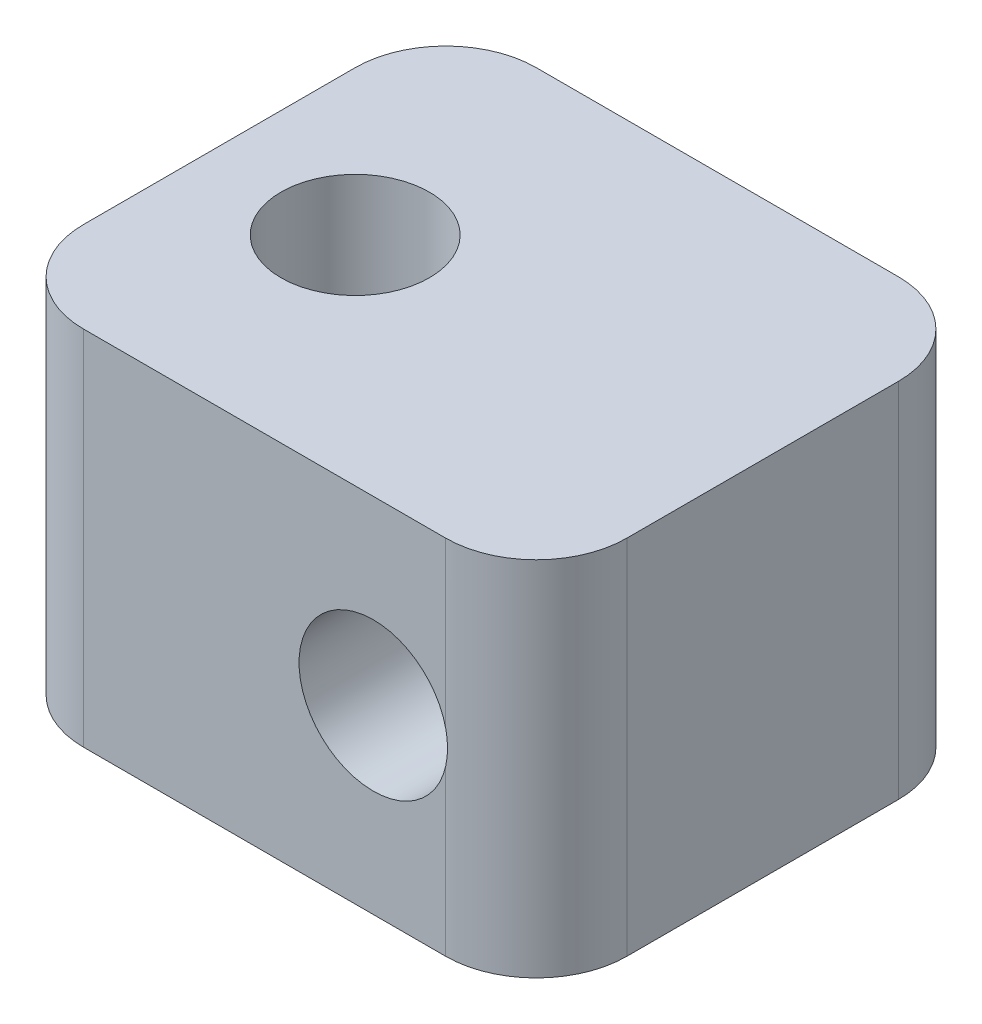
ISO-10303-21;
HEADER;
FILE_DESCRIPTION(('STEP AP214'),'2;1');
FILE_NAME('part.step','',(''),(''),'','','');
FILE_SCHEMA(('AUTOMOTIVE_DESIGN { 1 0 10303 214 1 1 1 1 }'));
ENDSEC;
DATA;
#1=APPLICATION_CONTEXT('core data for automotive mechanical design processes');
#2=APPLICATION_PROTOCOL_DEFINITION('international standard','automotive_design',2000,#1);
#3=PRODUCT_CONTEXT('',#1,'mechanical');
#4=PRODUCT('Part','Part','',(#3));
#5=PRODUCT_RELATED_PRODUCT_CATEGORY('part','',(#4));
#6=PRODUCT_DEFINITION_FORMATION('','',#4);
#7=PRODUCT_DEFINITION_CONTEXT('part definition',#1,'design');
#8=PRODUCT_DEFINITION('design','',#6,#7);
#9=PRODUCT_DEFINITION_SHAPE('','',#8);
#10=(LENGTH_UNIT() NAMED_UNIT(*) SI_UNIT(.MILLI.,.METRE.));
#11=(NAMED_UNIT(*) PLANE_ANGLE_UNIT() SI_UNIT($,.RADIAN.));
#12=(NAMED_UNIT(*) SI_UNIT($,.STERADIAN.) SOLID_ANGLE_UNIT());
#13=UNCERTAINTY_MEASURE_WITH_UNIT(LENGTH_MEASURE(1.E-05),#10,'distance_accuracy_value','');
#14=(GEOMETRIC_REPRESENTATION_CONTEXT(3) GLOBAL_UNCERTAINTY_ASSIGNED_CONTEXT((#13)) GLOBAL_UNIT_ASSIGNED_CONTEXT((#10,
#11,#12)) REPRESENTATION_CONTEXT('',''));
#15=CARTESIAN_POINT('',(0.,0.,0.));
#16=DIRECTION('',(0.,0.,1.));
#17=DIRECTION('',(1.,0.,0.));
#18=AXIS2_PLACEMENT_3D('',#15,#16,#17);
#19=CARTESIAN_POINT('',(15.,10.,25.));
#20=DIRECTION('',(-1.,0.,0.));
#21=DIRECTION('',(0.,-1.,0.));
#22=AXIS2_PLACEMENT_3D('',#19,#20,#21);
#23=PLANE('',#22);
#24=DIRECTION('',(0.,0.,-1.));
#25=VECTOR('',#24,1.);
#26=CARTESIAN_POINT('',(15.,10.,25.));
#27=LINE('',#26,#25);
#28=CARTESIAN_POINT('',(15.,10.,20.));
#29=VERTEX_POINT('',#28);
#30=CARTESIAN_POINT('',(15.,10.,5.));
#31=VERTEX_POINT('',#30);
#32=EDGE_CURVE('E140',#29,#31,#27,.T.);
#33=ORIENTED_EDGE('',*,*,#32,.F.);
#34=DIRECTION('',(0.,1.,0.));
#35=VECTOR('',#34,1.);
#36=CARTESIAN_POINT('',(15.,-10.,20.));
#37=LINE('',#36,#35);
#38=CARTESIAN_POINT('',(15.,-10.,20.));
#39=VERTEX_POINT('',#38);
#40=EDGE_CURVE('E258',#29,#39,#37,.F.);
#41=ORIENTED_EDGE('',*,*,#40,.T.);
#42=DIRECTION('',(0.,0.,-1.));
#43=VECTOR('',#42,1.);
#44=CARTESIAN_POINT('',(15.,-10.,25.));
#45=LINE('',#44,#43);
#46=CARTESIAN_POINT('',(15.,-10.,5.));
#47=VERTEX_POINT('',#46);
#48=EDGE_CURVE('E211',#39,#47,#45,.T.);
#49=ORIENTED_EDGE('',*,*,#48,.T.);
#50=DIRECTION('',(0.,1.,0.));
#51=VECTOR('',#50,1.);
#52=CARTESIAN_POINT('',(15.,10.,5.));
#53=LINE('',#52,#51);
#54=EDGE_CURVE('E255',#47,#31,#53,.T.);
#55=ORIENTED_EDGE('',*,*,#54,.T.);
#56=EDGE_LOOP('',(#33,#41,#49,#55));
#57=FACE_BOUND('',#56,.T.);
#58=ADVANCED_FACE('F33',(#57),#23,.F.);
#59=CARTESIAN_POINT('',(-15.,10.,25.));
#60=DIRECTION('',(0.,-1.,0.));
#61=DIRECTION('',(0.,0.,-1.));
#62=AXIS2_PLACEMENT_3D('',#59,#60,#61);
#63=PLANE('',#62);
#64=CARTESIAN_POINT('',(-7.,10.,13.));
#65=DIRECTION('',(0.,1.,0.));
#66=DIRECTION('',(0.,0.,1.));
#67=AXIS2_PLACEMENT_3D('',#64,#65,#66);
#68=CIRCLE('',#67,4.1);
#69=CARTESIAN_POINT('',(-7.,10.,17.1));
#70=VERTEX_POINT('',#69);
#71=EDGE_CURVE('E199',#70,#70,#68,.T.);
#72=ORIENTED_EDGE('',*,*,#71,.F.);
#73=EDGE_LOOP('',(#72));
#74=FACE_BOUND('',#73,.T.);
#75=DIRECTION('',(-1.,0.,0.));
#76=VECTOR('',#75,1.);
#77=CARTESIAN_POINT('',(-15.,10.,25.));
#78=LINE('',#77,#76);
#79=CARTESIAN_POINT('',(10.,10.,25.));
#80=VERTEX_POINT('',#79);
#81=CARTESIAN_POINT('',(-10.,10.,25.));
#82=VERTEX_POINT('',#81);
#83=EDGE_CURVE('E218',#80,#82,#78,.T.);
#84=ORIENTED_EDGE('',*,*,#83,.F.);
#85=CARTESIAN_POINT('',(10.,10.,20.));
#86=DIRECTION('',(0.,-1.,0.));
#87=DIRECTION('',(0.,0.,-1.));
#88=AXIS2_PLACEMENT_3D('',#85,#86,#87);
#89=CIRCLE('',#88,5.);
#90=EDGE_CURVE('E135',#80,#29,#89,.F.);
#91=ORIENTED_EDGE('',*,*,#90,.T.);
#92=ORIENTED_EDGE('',*,*,#32,.T.);
#93=CARTESIAN_POINT('',(10.,10.,5.));
#94=DIRECTION('',(0.,-1.,0.));
#95=DIRECTION('',(0.,0.,-1.));
#96=AXIS2_PLACEMENT_3D('',#93,#94,#95);
#97=CIRCLE('',#96,5.);
#98=CARTESIAN_POINT('',(10.,10.,0.));
#99=VERTEX_POINT('',#98);
#100=EDGE_CURVE('E250',#31,#99,#97,.F.);
#101=ORIENTED_EDGE('',*,*,#100,.T.);
#102=DIRECTION('',(-1.,0.,0.));
#103=VECTOR('',#102,1.);
#104=CARTESIAN_POINT('',(-15.,10.,0.));
#105=LINE('',#104,#103);
#106=CARTESIAN_POINT('',(-10.,10.,0.));
#107=VERTEX_POINT('',#106);
#108=EDGE_CURVE('E219',#99,#107,#105,.T.);
#109=ORIENTED_EDGE('',*,*,#108,.T.);
#110=CARTESIAN_POINT('',(-10.,10.,5.));
#111=DIRECTION('',(0.,-1.,0.));
#112=DIRECTION('',(0.,0.,-1.));
#113=AXIS2_PLACEMENT_3D('',#110,#111,#112);
#114=CIRCLE('',#113,5.);
#115=CARTESIAN_POINT('',(-15.,10.,5.));
#116=VERTEX_POINT('',#115);
#117=EDGE_CURVE('E248',#107,#116,#114,.F.);
#118=ORIENTED_EDGE('',*,*,#117,.T.);
#119=DIRECTION('',(0.,0.,-1.));
#120=VECTOR('',#119,1.);
#121=CARTESIAN_POINT('',(-15.,10.,25.));
#122=LINE('',#121,#120);
#123=CARTESIAN_POINT('',(-15.,10.,20.));
#124=VERTEX_POINT('',#123);
#125=EDGE_CURVE('E206',#124,#116,#122,.T.);
#126=ORIENTED_EDGE('',*,*,#125,.F.);
#127=CARTESIAN_POINT('',(-10.,10.,20.));
#128=DIRECTION('',(0.,-1.,0.));
#129=DIRECTION('',(0.,0.,-1.));
#130=AXIS2_PLACEMENT_3D('',#127,#128,#129);
#131=CIRCLE('',#130,5.);
#132=EDGE_CURVE('E118',#124,#82,#131,.F.);
#133=ORIENTED_EDGE('',*,*,#132,.T.);
#134=EDGE_LOOP('',(#84,#91,#92,#101,#109,#118,#126,#133));
#135=FACE_BOUND('',#134,.T.);
#136=ADVANCED_FACE('F178',(#74,#135),#63,.F.);
#137=CARTESIAN_POINT('',(-15.,10.,25.));
#138=DIRECTION('',(1.,0.,0.));
#139=DIRECTION('',(0.,1.,0.));
#140=AXIS2_PLACEMENT_3D('',#137,#138,#139);
#141=PLANE('',#140);
#142=ORIENTED_EDGE('',*,*,#125,.T.);
#143=DIRECTION('',(0.,-1.,0.));
#144=VECTOR('',#143,1.);
#145=CARTESIAN_POINT('',(-15.,10.,5.));
#146=LINE('',#145,#144);
#147=CARTESIAN_POINT('',(-15.,-10.,5.));
#148=VERTEX_POINT('',#147);
#149=EDGE_CURVE('E11',#116,#148,#146,.T.);
#150=ORIENTED_EDGE('',*,*,#149,.T.);
#151=DIRECTION('',(0.,0.,-1.));
#152=VECTOR('',#151,1.);
#153=CARTESIAN_POINT('',(-15.,-10.,25.));
#154=LINE('',#153,#152);
#155=CARTESIAN_POINT('',(-15.,-10.,20.));
#156=VERTEX_POINT('',#155);
#157=EDGE_CURVE('E209',#156,#148,#154,.T.);
#158=ORIENTED_EDGE('',*,*,#157,.F.);
#159=DIRECTION('',(0.,-1.,0.));
#160=VECTOR('',#159,1.);
#161=CARTESIAN_POINT('',(-15.,10.,20.));
#162=LINE('',#161,#160);
#163=EDGE_CURVE('E41',#156,#124,#162,.F.);
#164=ORIENTED_EDGE('',*,*,#163,.T.);
#165=EDGE_LOOP('',(#142,#150,#158,#164));
#166=FACE_BOUND('',#165,.T.);
#167=ADVANCED_FACE('F174',(#166),#141,.F.);
#168=CARTESIAN_POINT('',(-15.,-10.,25.));
#169=DIRECTION('',(0.,1.,0.));
#170=DIRECTION('',(0.,0.,1.));
#171=AXIS2_PLACEMENT_3D('',#168,#169,#170);
#172=PLANE('',#171);
#173=CARTESIAN_POINT('',(-7.,-10.,13.));
#174=DIRECTION('',(0.,1.,0.));
#175=DIRECTION('',(0.,0.,1.));
#176=AXIS2_PLACEMENT_3D('',#173,#174,#175);
#177=CIRCLE('',#176,4.1);
#178=CARTESIAN_POINT('',(-7.,-10.,17.1));
#179=VERTEX_POINT('',#178);
#180=EDGE_CURVE('E129',#179,#179,#177,.T.);
#181=ORIENTED_EDGE('',*,*,#180,.T.);
#182=EDGE_LOOP('',(#181));
#183=FACE_BOUND('',#182,.T.);
#184=ORIENTED_EDGE('',*,*,#48,.F.);
#185=CARTESIAN_POINT('',(10.,-10.,20.));
#186=DIRECTION('',(0.,1.,0.));
#187=DIRECTION('',(0.,0.,1.));
#188=AXIS2_PLACEMENT_3D('',#185,#186,#187);
#189=CIRCLE('',#188,5.);
#190=CARTESIAN_POINT('',(10.,-10.,25.));
#191=VERTEX_POINT('',#190);
#192=EDGE_CURVE('E239',#39,#191,#189,.F.);
#193=ORIENTED_EDGE('',*,*,#192,.T.);
#194=DIRECTION('',(1.,0.,0.));
#195=VECTOR('',#194,1.);
#196=CARTESIAN_POINT('',(-15.,-10.,25.));
#197=LINE('',#196,#195);
#198=CARTESIAN_POINT('',(-10.,-10.,25.));
#199=VERTEX_POINT('',#198);
#200=EDGE_CURVE('E214',#199,#191,#197,.T.);
#201=ORIENTED_EDGE('',*,*,#200,.F.);
#202=CARTESIAN_POINT('',(-10.,-10.,20.));
#203=DIRECTION('',(0.,1.,0.));
#204=DIRECTION('',(0.,0.,1.));
#205=AXIS2_PLACEMENT_3D('',#202,#203,#204);
#206=CIRCLE('',#205,5.);
#207=EDGE_CURVE('E55',#199,#156,#206,.F.);
#208=ORIENTED_EDGE('',*,*,#207,.T.);
#209=ORIENTED_EDGE('',*,*,#157,.T.);
#210=CARTESIAN_POINT('',(-10.,-10.,5.));
#211=DIRECTION('',(0.,1.,0.));
#212=DIRECTION('',(0.,0.,1.));
#213=AXIS2_PLACEMENT_3D('',#210,#211,#212);
#214=CIRCLE('',#213,5.);
#215=CARTESIAN_POINT('',(-10.,-10.,0.));
#216=VERTEX_POINT('',#215);
#217=EDGE_CURVE('E48',#148,#216,#214,.F.);
#218=ORIENTED_EDGE('',*,*,#217,.T.);
#219=DIRECTION('',(1.,0.,0.));
#220=VECTOR('',#219,1.);
#221=CARTESIAN_POINT('',(-15.,-10.,0.));
#222=LINE('',#221,#220);
#223=CARTESIAN_POINT('',(10.,-10.,0.));
#224=VERTEX_POINT('',#223);
#225=EDGE_CURVE('E215',#216,#224,#222,.T.);
#226=ORIENTED_EDGE('',*,*,#225,.T.);
#227=CARTESIAN_POINT('',(10.,-10.,5.));
#228=DIRECTION('',(0.,1.,0.));
#229=DIRECTION('',(0.,0.,1.));
#230=AXIS2_PLACEMENT_3D('',#227,#228,#229);
#231=CIRCLE('',#230,5.);
#232=EDGE_CURVE('E235',#224,#47,#231,.F.);
#233=ORIENTED_EDGE('',*,*,#232,.T.);
#234=EDGE_LOOP('',(#184,#193,#201,#208,#209,#218,#226,#233));
#235=FACE_BOUND('',#234,.T.);
#236=ADVANCED_FACE('F168',(#183,#235),#172,.F.);
#237=CARTESIAN_POINT('',(0.,0.,25.));
#238=DIRECTION('',(0.,0.,1.));
#239=DIRECTION('',(1.,0.,0.));
#240=AXIS2_PLACEMENT_3D('',#237,#238,#239);
#241=PLANE('',#240);
#242=ORIENTED_EDGE('',*,*,#200,.T.);
#243=DIRECTION('',(0.,1.,0.));
#244=VECTOR('',#243,1.);
#245=CARTESIAN_POINT('',(10.,10.,25.));
#246=LINE('',#245,#244);
#247=CARTESIAN_POINT('',(10.,-0.900000000000013,25.));
#248=VERTEX_POINT('',#247);
#249=EDGE_CURVE('E127',#191,#248,#246,.T.);
#250=ORIENTED_EDGE('',*,*,#249,.T.);
#251=CARTESIAN_POINT('',(6.,0.,25.));
#252=DIRECTION('',(0.,0.,1.));
#253=DIRECTION('',(1.,0.,0.));
#254=AXIS2_PLACEMENT_3D('',#251,#252,#253);
#255=CIRCLE('',#254,4.1);
#256=CARTESIAN_POINT('',(10.,0.900000000000014,25.));
#257=VERTEX_POINT('',#256);
#258=EDGE_CURVE('E113',#257,#248,#255,.T.);
#259=ORIENTED_EDGE('',*,*,#258,.F.);
#260=DIRECTION('',(0.,1.,0.));
#261=VECTOR('',#260,1.);
#262=CARTESIAN_POINT('',(10.,10.,25.));
#263=LINE('',#262,#261);
#264=EDGE_CURVE('E125',#257,#80,#263,.T.);
#265=ORIENTED_EDGE('',*,*,#264,.T.);
#266=ORIENTED_EDGE('',*,*,#83,.T.);
#267=DIRECTION('',(0.,-1.,0.));
#268=VECTOR('',#267,1.);
#269=CARTESIAN_POINT('',(-10.,-10.,25.));
#270=LINE('',#269,#268);
#271=EDGE_CURVE('E136',#82,#199,#270,.T.);
#272=ORIENTED_EDGE('',*,*,#271,.T.);
#273=EDGE_LOOP('',(#242,#250,#259,#265,#266,#272));
#274=FACE_BOUND('',#273,.T.);
#275=ADVANCED_FACE('F123',(#274),#241,.T.);
#276=CARTESIAN_POINT('',(0.,0.,0.));
#277=DIRECTION('',(0.,0.,1.));
#278=DIRECTION('',(1.,0.,0.));
#279=AXIS2_PLACEMENT_3D('',#276,#277,#278);
#280=PLANE('',#279);
#281=ORIENTED_EDGE('',*,*,#108,.F.);
#282=DIRECTION('',(0.,1.,0.));
#283=VECTOR('',#282,1.);
#284=CARTESIAN_POINT('',(10.,0.,0.));
#285=LINE('',#284,#283);
#286=CARTESIAN_POINT('',(10.,0.90000000000001,0.));
#287=VERTEX_POINT('',#286);
#288=EDGE_CURVE('E231',#99,#287,#285,.F.);
#289=ORIENTED_EDGE('',*,*,#288,.T.);
#290=CARTESIAN_POINT('',(6.,0.,0.));
#291=DIRECTION('',(0.,0.,1.));
#292=DIRECTION('',(1.,0.,0.));
#293=AXIS2_PLACEMENT_3D('',#290,#291,#292);
#294=CIRCLE('',#293,4.1);
#295=CARTESIAN_POINT('',(10.,-0.90000000000001,0.));
#296=VERTEX_POINT('',#295);
#297=EDGE_CURVE('E128',#287,#296,#294,.T.);
#298=ORIENTED_EDGE('',*,*,#297,.T.);
#299=DIRECTION('',(0.,1.,0.));
#300=VECTOR('',#299,1.);
#301=CARTESIAN_POINT('',(10.,0.,0.));
#302=LINE('',#301,#300);
#303=EDGE_CURVE('E229',#296,#224,#302,.F.);
#304=ORIENTED_EDGE('',*,*,#303,.T.);
#305=ORIENTED_EDGE('',*,*,#225,.F.);
#306=DIRECTION('',(0.,-1.,0.));
#307=VECTOR('',#306,1.);
#308=CARTESIAN_POINT('',(-10.,0.,0.));
#309=LINE('',#308,#307);
#310=EDGE_CURVE('E236',#216,#107,#309,.F.);
#311=ORIENTED_EDGE('',*,*,#310,.T.);
#312=EDGE_LOOP('',(#281,#289,#298,#304,#305,#311));
#313=FACE_BOUND('',#312,.T.);
#314=ADVANCED_FACE('F163',(#313),#280,.F.);
#315=CARTESIAN_POINT('',(6.,0.,0.));
#316=DIRECTION('',(0.,0.,1.));
#317=DIRECTION('',(1.,0.,0.));
#318=AXIS2_PLACEMENT_3D('',#315,#316,#317);
#319=CYLINDRICAL_SURFACE('',#318,4.1);
#320=ORIENTED_EDGE('',*,*,#297,.F.);
#321=CARTESIAN_POINT('',(10.,0.90000000000001,0.));
#322=CARTESIAN_POINT('',(10.0255431669266,0.786535526765955,3.0454034820562E-05));
#323=CARTESIAN_POINT('',(10.0462329663475,0.671978797259911,0.000197037251003355));
#324=CARTESIAN_POINT('',(10.077820360937,0.441465188419724,0.000572449688951757));
#325=CARTESIAN_POINT('',(10.0887131108687,0.325507644995217,0.000781299751766091));
#326=CARTESIAN_POINT('',(10.100487073114,0.0952113897353871,0.00100865460800304));
#327=CARTESIAN_POINT('',(10.1015473664454,-0.019118245095872,0.00103056361249383));
#328=CARTESIAN_POINT('',(10.0941200075888,-0.247408124587831,0.000883905683873959));
#329=CARTESIAN_POINT('',(10.0856381729189,-0.361368551881887,0.000715454806572953));
#330=CARTESIAN_POINT('',(10.06411540274,-0.545997641210822,0.000404517454005873));
#331=CARTESIAN_POINT('',(10.0539409836193,-0.61701282283904,0.000275653706210293));
#332=CARTESIAN_POINT('',(10.0298125819898,-0.758824549477599,7.5089967097217E-05));
#333=CARTESIAN_POINT('',(10.0158369008814,-0.829617403374074,3.72777365891998E-06));
#334=CARTESIAN_POINT('',(10.,-0.90000000000001,0.));
#335=B_SPLINE_CURVE_WITH_KNOTS('',3,(#321,#322,#323,#324,#325,#326,#327,#328,#329,#330,#331,
#332,#333,#334),.UNSPECIFIED.,.F.,.F.,(4,2,2,2,2,2,4),(0.,0.34880827130801,0.697788954813332,
1.04040079809229,1.38280387546423,1.59793444378268,1.8143197852524),.UNSPECIFIED.);
#336=EDGE_CURVE('E119',#287,#296,#335,.T.);
#337=ORIENTED_EDGE('',*,*,#336,.T.);
#338=EDGE_LOOP('',(#320,#337));
#339=FACE_BOUND('',#338,.T.);
#340=ORIENTED_EDGE('',*,*,#258,.T.);
#341=CARTESIAN_POINT('',(10.,-0.900000000000013,25.));
#342=CARTESIAN_POINT('',(10.0255431669266,-0.786535526765958,24.9999695459652));
#343=CARTESIAN_POINT('',(10.0462329663475,-0.671978797259915,24.999802962749));
#344=CARTESIAN_POINT('',(10.077820360937,-0.441465188419727,24.999427550311));
#345=CARTESIAN_POINT('',(10.0887131108687,-0.32550764499522,24.9992187002482));
#346=CARTESIAN_POINT('',(10.100487073114,-0.0952113897353903,24.998991345392));
#347=CARTESIAN_POINT('',(10.1015473664454,0.0191182450958688,24.9989694363875));
#348=CARTESIAN_POINT('',(10.0941200075888,0.247408124587828,24.9991160943161));
#349=CARTESIAN_POINT('',(10.0856381729189,0.361368551881884,24.9992845451934));
#350=CARTESIAN_POINT('',(10.06411540274,0.54599764121082,24.999595482546));
#351=CARTESIAN_POINT('',(10.0539409836193,0.617012822839039,24.9997243462938));
#352=CARTESIAN_POINT('',(10.0298125819898,0.758824549477601,24.9999249100329));
#353=CARTESIAN_POINT('',(10.0158369008814,0.829617403374077,24.9999962722263));
#354=CARTESIAN_POINT('',(10.,0.900000000000014,25.));
#355=B_SPLINE_CURVE_WITH_KNOTS('',3,(#341,#342,#343,#344,#345,#346,#347,#348,#349,#350,#351,
#352,#353,#354),.UNSPECIFIED.,.F.,.F.,(4,2,2,2,2,2,4),(0.,0.34880827130801,0.697788954813332,
1.04040079809229,1.38280387546423,1.59793444378268,1.81431978525241),.UNSPECIFIED.);
#356=EDGE_CURVE('E110',#248,#257,#355,.T.);
#357=ORIENTED_EDGE('',*,*,#356,.T.);
#358=EDGE_LOOP('',(#340,#357));
#359=FACE_BOUND('',#358,.T.);
#360=ADVANCED_FACE('F112',(#339,#359),#319,.F.);
#361=CARTESIAN_POINT('',(-7.,-15.,13.));
#362=DIRECTION('',(0.,1.,0.));
#363=DIRECTION('',(0.,0.,1.));
#364=AXIS2_PLACEMENT_3D('',#361,#362,#363);
#365=CYLINDRICAL_SURFACE('',#364,4.1);
#366=ORIENTED_EDGE('',*,*,#71,.T.);
#367=EDGE_LOOP('',(#366));
#368=FACE_BOUND('',#367,.T.);
#369=ORIENTED_EDGE('',*,*,#180,.F.);
#370=EDGE_LOOP('',(#369));
#371=FACE_BOUND('',#370,.T.);
#372=ADVANCED_FACE('F162',(#368,#371),#365,.F.);
#373=CARTESIAN_POINT('',(10.,0.,20.));
#374=DIRECTION('',(0.,-1.,0.));
#375=DIRECTION('',(1.,0.,0.));
#376=AXIS2_PLACEMENT_3D('',#373,#374,#375);
#377=CYLINDRICAL_SURFACE('',#376,5.);
#378=ORIENTED_EDGE('',*,*,#192,.F.);
#379=ORIENTED_EDGE('',*,*,#40,.F.);
#380=ORIENTED_EDGE('',*,*,#90,.F.);
#381=ORIENTED_EDGE('',*,*,#264,.F.);
#382=ORIENTED_EDGE('',*,*,#356,.F.);
#383=ORIENTED_EDGE('',*,*,#249,.F.);
#384=EDGE_LOOP('',(#378,#379,#380,#381,#382,#383));
#385=FACE_BOUND('',#384,.T.);
#386=ADVANCED_FACE('F133',(#385),#377,.T.);
#387=CARTESIAN_POINT('',(10.,10.,5.));
#388=DIRECTION('',(0.,1.,0.));
#389=DIRECTION('',(-1.,0.,0.));
#390=AXIS2_PLACEMENT_3D('',#387,#388,#389);
#391=CYLINDRICAL_SURFACE('',#390,5.);
#392=ORIENTED_EDGE('',*,*,#336,.F.);
#393=ORIENTED_EDGE('',*,*,#288,.F.);
#394=ORIENTED_EDGE('',*,*,#100,.F.);
#395=ORIENTED_EDGE('',*,*,#54,.F.);
#396=ORIENTED_EDGE('',*,*,#232,.F.);
#397=ORIENTED_EDGE('',*,*,#303,.F.);
#398=EDGE_LOOP('',(#392,#393,#394,#395,#396,#397));
#399=FACE_BOUND('',#398,.T.);
#400=ADVANCED_FACE('F156',(#399),#391,.T.);
#401=CARTESIAN_POINT('',(-10.,10.,5.));
#402=DIRECTION('',(0.,-1.,0.));
#403=DIRECTION('',(1.,0.,0.));
#404=AXIS2_PLACEMENT_3D('',#401,#402,#403);
#405=CYLINDRICAL_SURFACE('',#404,5.);
#406=ORIENTED_EDGE('',*,*,#117,.F.);
#407=ORIENTED_EDGE('',*,*,#310,.F.);
#408=ORIENTED_EDGE('',*,*,#217,.F.);
#409=ORIENTED_EDGE('',*,*,#149,.F.);
#410=EDGE_LOOP('',(#406,#407,#408,#409));
#411=FACE_BOUND('',#410,.T.);
#412=ADVANCED_FACE('F191',(#411),#405,.T.);
#413=CARTESIAN_POINT('',(-10.,0.,20.));
#414=DIRECTION('',(0.,1.,0.));
#415=DIRECTION('',(-1.,0.,0.));
#416=AXIS2_PLACEMENT_3D('',#413,#414,#415);
#417=CYLINDRICAL_SURFACE('',#416,5.);
#418=ORIENTED_EDGE('',*,*,#132,.F.);
#419=ORIENTED_EDGE('',*,*,#163,.F.);
#420=ORIENTED_EDGE('',*,*,#207,.F.);
#421=ORIENTED_EDGE('',*,*,#271,.F.);
#422=EDGE_LOOP('',(#418,#419,#420,#421));
#423=FACE_BOUND('',#422,.T.);
#424=ADVANCED_FACE('F35',(#423),#417,.T.);
#425=CLOSED_SHELL('',(#58,#136,#167,#236,#275,#314,#360,#372,#386,#400,#412,#424));
#426=MANIFOLD_SOLID_BREP('B2',#425);
#427=ADVANCED_BREP_SHAPE_REPRESENTATION('',(#18,#426),#14);
#428=SHAPE_DEFINITION_REPRESENTATION(#9,#427);
ENDSEC;
END-ISO-10303-21;
